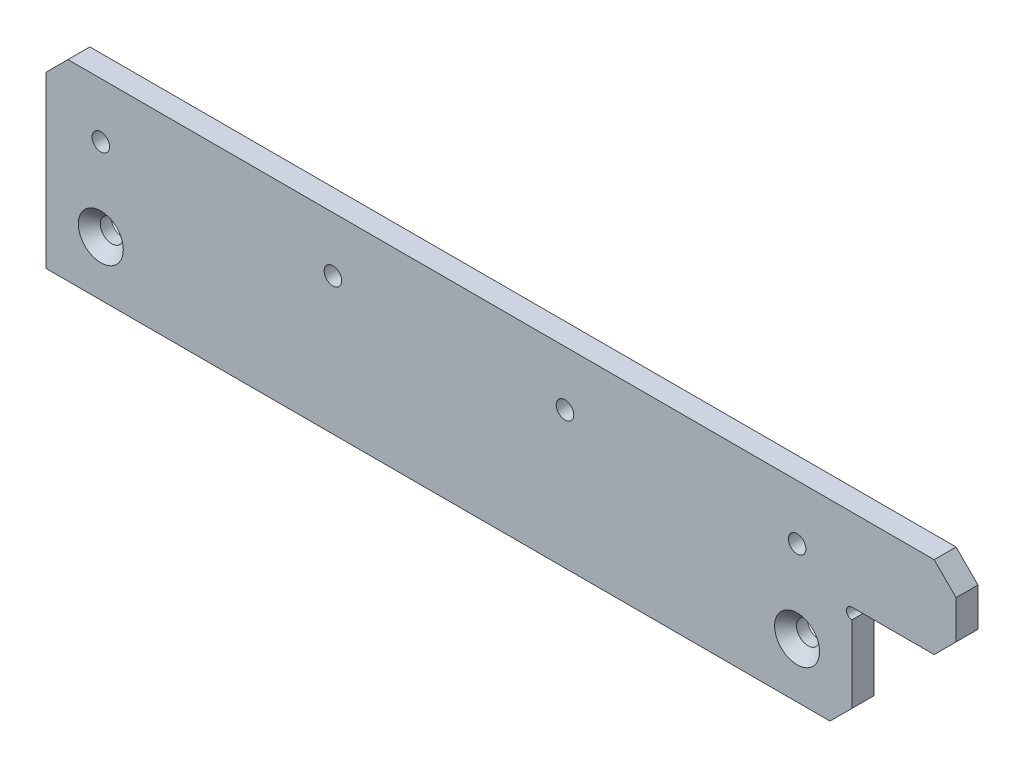
ISO-10303-21;
HEADER;
FILE_DESCRIPTION(('STEP AP214'),'2;1');
FILE_NAME('part.step','',(''),(''),'','','');
FILE_SCHEMA(('AUTOMOTIVE_DESIGN { 1 0 10303 214 1 1 1 1 }'));
ENDSEC;
DATA;
#1=APPLICATION_CONTEXT('core data for automotive mechanical design processes');
#2=APPLICATION_PROTOCOL_DEFINITION('international standard','automotive_design',2000,#1);
#3=PRODUCT_CONTEXT('',#1,'mechanical');
#4=PRODUCT('Part','Part','',(#3));
#5=PRODUCT_RELATED_PRODUCT_CATEGORY('part','',(#4));
#6=PRODUCT_DEFINITION_FORMATION('','',#4);
#7=PRODUCT_DEFINITION_CONTEXT('part definition',#1,'design');
#8=PRODUCT_DEFINITION('design','',#6,#7);
#9=PRODUCT_DEFINITION_SHAPE('','',#8);
#10=(LENGTH_UNIT() NAMED_UNIT(*) SI_UNIT(.MILLI.,.METRE.));
#11=(NAMED_UNIT(*) PLANE_ANGLE_UNIT() SI_UNIT($,.RADIAN.));
#12=(NAMED_UNIT(*) SI_UNIT($,.STERADIAN.) SOLID_ANGLE_UNIT());
#13=UNCERTAINTY_MEASURE_WITH_UNIT(LENGTH_MEASURE(1.E-05),#10,'distance_accuracy_value','');
#14=(GEOMETRIC_REPRESENTATION_CONTEXT(3) GLOBAL_UNCERTAINTY_ASSIGNED_CONTEXT((#13)) GLOBAL_UNIT_ASSIGNED_CONTEXT((#10,
#11,#12)) REPRESENTATION_CONTEXT('',''));
#15=CARTESIAN_POINT('',(0.,0.,0.));
#16=DIRECTION('',(0.,0.,1.));
#17=DIRECTION('',(1.,0.,0.));
#18=AXIS2_PLACEMENT_3D('',#15,#16,#17);
#19=CARTESIAN_POINT('',(-73.5,-17.5,2.));
#20=DIRECTION('',(1.,0.,0.));
#21=DIRECTION('',(0.,0.,-1.));
#22=AXIS2_PLACEMENT_3D('',#19,#20,#21);
#23=PLANE('',#22);
#24=DIRECTION('',(0.,-1.,0.));
#25=VECTOR('',#24,1.);
#26=CARTESIAN_POINT('',(-73.5,-17.5,2.));
#27=LINE('',#26,#25);
#28=CARTESIAN_POINT('',(-73.5,13.5,2.));
#29=VERTEX_POINT('',#28);
#30=CARTESIAN_POINT('',(-73.5,-17.5,2.));
#31=VERTEX_POINT('',#30);
#32=EDGE_CURVE('E160',#29,#31,#27,.T.);
#33=ORIENTED_EDGE('',*,*,#32,.F.);
#34=DIRECTION('',(0.,0.,-1.));
#35=VECTOR('',#34,1.);
#36=CARTESIAN_POINT('',(-73.5,13.5,2.));
#37=LINE('',#36,#35);
#38=CARTESIAN_POINT('',(-73.5,13.5,-2.));
#39=VERTEX_POINT('',#38);
#40=EDGE_CURVE('E210',#29,#39,#37,.T.);
#41=ORIENTED_EDGE('',*,*,#40,.T.);
#42=DIRECTION('',(0.,-1.,0.));
#43=VECTOR('',#42,1.);
#44=CARTESIAN_POINT('',(-73.5,-17.5,-2.));
#45=LINE('',#44,#43);
#46=CARTESIAN_POINT('',(-73.5,-17.5,-2.));
#47=VERTEX_POINT('',#46);
#48=EDGE_CURVE('E132',#39,#47,#45,.T.);
#49=ORIENTED_EDGE('',*,*,#48,.T.);
#50=DIRECTION('',(0.,0.,-1.));
#51=VECTOR('',#50,1.);
#52=CARTESIAN_POINT('',(-73.5,-17.5,2.));
#53=LINE('',#52,#51);
#54=EDGE_CURVE('E170',#31,#47,#53,.T.);
#55=ORIENTED_EDGE('',*,*,#54,.F.);
#56=EDGE_LOOP('',(#33,#41,#49,#55));
#57=FACE_BOUND('',#56,.T.);
#58=ADVANCED_FACE('F37',(#57),#23,.F.);
#59=CARTESIAN_POINT('',(73.5,-17.5,2.));
#60=DIRECTION('',(0.,1.,0.));
#61=DIRECTION('',(-1.,0.,0.));
#62=AXIS2_PLACEMENT_3D('',#59,#60,#61);
#63=PLANE('',#62);
#64=DIRECTION('',(1.,0.,0.));
#65=VECTOR('',#64,1.);
#66=CARTESIAN_POINT('',(73.5,-17.5,-2.));
#67=LINE('',#66,#65);
#68=CARTESIAN_POINT('',(69.5,-17.5,-2.));
#69=VERTEX_POINT('',#68);
#70=EDGE_CURVE('E172',#47,#69,#67,.T.);
#71=ORIENTED_EDGE('',*,*,#70,.T.);
#72=DIRECTION('',(0.,0.,1.));
#73=VECTOR('',#72,1.);
#74=CARTESIAN_POINT('',(69.5,-17.5,2.));
#75=LINE('',#74,#73);
#76=CARTESIAN_POINT('',(69.5,-17.5,2.));
#77=VERTEX_POINT('',#76);
#78=EDGE_CURVE('E208',#69,#77,#75,.T.);
#79=ORIENTED_EDGE('',*,*,#78,.T.);
#80=DIRECTION('',(1.,0.,0.));
#81=VECTOR('',#80,1.);
#82=CARTESIAN_POINT('',(73.5,-17.5,2.));
#83=LINE('',#82,#81);
#84=EDGE_CURVE('E162',#31,#77,#83,.T.);
#85=ORIENTED_EDGE('',*,*,#84,.F.);
#86=ORIENTED_EDGE('',*,*,#54,.T.);
#87=EDGE_LOOP('',(#71,#79,#85,#86));
#88=FACE_BOUND('',#87,.T.);
#89=ADVANCED_FACE('F267',(#88),#63,.F.);
#90=CARTESIAN_POINT('',(73.5,-17.5,2.));
#91=DIRECTION('',(-1.,0.,0.));
#92=DIRECTION('',(0.,0.,1.));
#93=AXIS2_PLACEMENT_3D('',#90,#91,#92);
#94=PLANE('',#93);
#95=DIRECTION('',(0.,1.,0.));
#96=VECTOR('',#95,1.);
#97=CARTESIAN_POINT('',(73.5,-17.5,-2.));
#98=LINE('',#97,#96);
#99=CARTESIAN_POINT('',(73.5,-13.5,-2.));
#100=VERTEX_POINT('',#99);
#101=CARTESIAN_POINT('',(73.5,0.500000000000011,-2.));
#102=VERTEX_POINT('',#101);
#103=EDGE_CURVE('E174',#100,#102,#98,.T.);
#104=ORIENTED_EDGE('',*,*,#103,.T.);
#105=DIRECTION('',(0.,0.,1.));
#106=VECTOR('',#105,1.);
#107=CARTESIAN_POINT('',(73.5,0.500000000000011,-2.));
#108=LINE('',#107,#106);
#109=CARTESIAN_POINT('',(73.5,0.500000000000011,2.));
#110=VERTEX_POINT('',#109);
#111=EDGE_CURVE('E237',#102,#110,#108,.T.);
#112=ORIENTED_EDGE('',*,*,#111,.T.);
#113=DIRECTION('',(0.,1.,0.));
#114=VECTOR('',#113,1.);
#115=CARTESIAN_POINT('',(73.5,-17.5,2.));
#116=LINE('',#115,#114);
#117=CARTESIAN_POINT('',(73.5,-13.5,2.));
#118=VERTEX_POINT('',#117);
#119=EDGE_CURVE('E141',#118,#110,#116,.T.);
#120=ORIENTED_EDGE('',*,*,#119,.F.);
#121=DIRECTION('',(0.,0.,-1.));
#122=VECTOR('',#121,1.);
#123=CARTESIAN_POINT('',(73.5,-13.5,2.));
#124=LINE('',#123,#122);
#125=EDGE_CURVE('E206',#118,#100,#124,.T.);
#126=ORIENTED_EDGE('',*,*,#125,.T.);
#127=EDGE_LOOP('',(#104,#112,#120,#126));
#128=FACE_BOUND('',#127,.T.);
#129=ADVANCED_FACE('F271',(#128),#94,.F.);
#130=CARTESIAN_POINT('',(73.5,17.5,2.));
#131=DIRECTION('',(0.,-1.,0.));
#132=DIRECTION('',(1.,0.,0.));
#133=AXIS2_PLACEMENT_3D('',#130,#131,#132);
#134=PLANE('',#133);
#135=DIRECTION('',(-1.,0.,0.));
#136=VECTOR('',#135,1.);
#137=CARTESIAN_POINT('',(73.5,17.5,2.));
#138=LINE('',#137,#136);
#139=CARTESIAN_POINT('',(88.5,17.5,2.));
#140=VERTEX_POINT('',#139);
#141=CARTESIAN_POINT('',(-69.5,17.5,2.));
#142=VERTEX_POINT('',#141);
#143=EDGE_CURVE('E167',#140,#142,#138,.T.);
#144=ORIENTED_EDGE('',*,*,#143,.F.);
#145=DIRECTION('',(0.,0.,-1.));
#146=VECTOR('',#145,1.);
#147=CARTESIAN_POINT('',(88.5,17.5,-2.));
#148=LINE('',#147,#146);
#149=CARTESIAN_POINT('',(88.5,17.5,-2.));
#150=VERTEX_POINT('',#149);
#151=EDGE_CURVE('E196',#140,#150,#148,.T.);
#152=ORIENTED_EDGE('',*,*,#151,.T.);
#153=DIRECTION('',(-1.,0.,0.));
#154=VECTOR('',#153,1.);
#155=CARTESIAN_POINT('',(73.5,17.5,-2.));
#156=LINE('',#155,#154);
#157=CARTESIAN_POINT('',(-69.5,17.5,-2.));
#158=VERTEX_POINT('',#157);
#159=EDGE_CURVE('E163',#150,#158,#156,.T.);
#160=ORIENTED_EDGE('',*,*,#159,.T.);
#161=DIRECTION('',(0.,0.,1.));
#162=VECTOR('',#161,1.);
#163=CARTESIAN_POINT('',(-69.5,17.5,2.));
#164=LINE('',#163,#162);
#165=EDGE_CURVE('E194',#158,#142,#164,.T.);
#166=ORIENTED_EDGE('',*,*,#165,.T.);
#167=EDGE_LOOP('',(#144,#152,#160,#166));
#168=FACE_BOUND('',#167,.T.);
#169=ADVANCED_FACE('F255',(#168),#134,.F.);
#170=CARTESIAN_POINT('',(0.,0.,2.));
#171=DIRECTION('',(0.,0.,1.));
#172=DIRECTION('',(1.,0.,0.));
#173=AXIS2_PLACEMENT_3D('',#170,#171,#172);
#174=PLANE('',#173);
#175=CARTESIAN_POINT('',(63.5,-7.50000000000001,2.));
#176=DIRECTION('',(0.,0.,1.));
#177=DIRECTION('',(1.,0.,0.));
#178=AXIS2_PLACEMENT_3D('',#175,#176,#177);
#179=CIRCLE('',#178,4.10000000000002);
#180=CARTESIAN_POINT('',(67.6,-7.50000000000001,2.));
#181=VERTEX_POINT('',#180);
#182=EDGE_CURVE('E46',#181,#181,#179,.F.);
#183=ORIENTED_EDGE('',*,*,#182,.T.);
#184=EDGE_LOOP('',(#183));
#185=FACE_BOUND('',#184,.T.);
#186=CARTESIAN_POINT('',(-63.5,-7.50000000000001,2.));
#187=DIRECTION('',(0.,0.,1.));
#188=DIRECTION('',(1.,0.,0.));
#189=AXIS2_PLACEMENT_3D('',#186,#187,#188);
#190=CIRCLE('',#189,4.10000000000002);
#191=CARTESIAN_POINT('',(-59.4,-7.50000000000001,2.));
#192=VERTEX_POINT('',#191);
#193=EDGE_CURVE('E216',#192,#192,#190,.F.);
#194=ORIENTED_EDGE('',*,*,#193,.T.);
#195=EDGE_LOOP('',(#194));
#196=FACE_BOUND('',#195,.T.);
#197=CARTESIAN_POINT('',(-63.5,7.49999999999999,2.));
#198=DIRECTION('',(0.,0.,1.));
#199=DIRECTION('',(1.,0.,0.));
#200=AXIS2_PLACEMENT_3D('',#197,#198,#199);
#201=CIRCLE('',#200,1.6);
#202=CARTESIAN_POINT('',(-61.9,7.49999999999999,2.));
#203=VERTEX_POINT('',#202);
#204=EDGE_CURVE('E293',#203,#203,#201,.T.);
#205=ORIENTED_EDGE('',*,*,#204,.F.);
#206=EDGE_LOOP('',(#205));
#207=FACE_BOUND('',#206,.T.);
#208=CARTESIAN_POINT('',(-21.1666666666667,7.49999999999999,2.));
#209=DIRECTION('',(0.,0.,1.));
#210=DIRECTION('',(1.,0.,0.));
#211=AXIS2_PLACEMENT_3D('',#208,#209,#210);
#212=CIRCLE('',#211,1.6);
#213=CARTESIAN_POINT('',(-19.5666666666667,7.49999999999999,2.));
#214=VERTEX_POINT('',#213);
#215=EDGE_CURVE('E287',#214,#214,#212,.T.);
#216=ORIENTED_EDGE('',*,*,#215,.F.);
#217=EDGE_LOOP('',(#216));
#218=FACE_BOUND('',#217,.T.);
#219=CARTESIAN_POINT('',(21.1666666666667,7.49999999999999,2.));
#220=DIRECTION('',(0.,0.,1.));
#221=DIRECTION('',(1.,0.,0.));
#222=AXIS2_PLACEMENT_3D('',#219,#220,#221);
#223=CIRCLE('',#222,1.6);
#224=CARTESIAN_POINT('',(22.7666666666667,7.49999999999999,2.));
#225=VERTEX_POINT('',#224);
#226=EDGE_CURVE('E281',#225,#225,#223,.T.);
#227=ORIENTED_EDGE('',*,*,#226,.F.);
#228=EDGE_LOOP('',(#227));
#229=FACE_BOUND('',#228,.T.);
#230=CARTESIAN_POINT('',(63.5,7.49999999999999,2.));
#231=DIRECTION('',(0.,0.,1.));
#232=DIRECTION('',(1.,0.,0.));
#233=AXIS2_PLACEMENT_3D('',#230,#231,#232);
#234=CIRCLE('',#233,1.6);
#235=CARTESIAN_POINT('',(65.1,7.49999999999999,2.));
#236=VERTEX_POINT('',#235);
#237=EDGE_CURVE('E275',#236,#236,#234,.T.);
#238=ORIENTED_EDGE('',*,*,#237,.F.);
#239=EDGE_LOOP('',(#238));
#240=FACE_BOUND('',#239,.T.);
#241=CARTESIAN_POINT('',(73.5,1.50000000000001,2.));
#242=DIRECTION('',(0.,0.,1.));
#243=DIRECTION('',(1.,0.,0.));
#244=AXIS2_PLACEMENT_3D('',#241,#242,#243);
#245=CIRCLE('',#244,0.999999999999998);
#246=CARTESIAN_POINT('',(73.5,2.50000000000001,2.));
#247=VERTEX_POINT('',#246);
#248=EDGE_CURVE('E124',#247,#110,#245,.T.);
#249=ORIENTED_EDGE('',*,*,#248,.F.);
#250=DIRECTION('',(1.,0.,0.));
#251=VECTOR('',#250,1.);
#252=CARTESIAN_POINT('',(73.5,2.50000000000001,2.));
#253=LINE('',#252,#251);
#254=CARTESIAN_POINT('',(88.5,2.50000000000001,2.));
#255=VERTEX_POINT('',#254);
#256=EDGE_CURVE('E139',#247,#255,#253,.T.);
#257=ORIENTED_EDGE('',*,*,#256,.T.);
#258=DIRECTION('',(-0.707106781186546,-0.707106781186549,0.));
#259=VECTOR('',#258,1.);
#260=CARTESIAN_POINT('',(43.0000000000001,-43.,2.));
#261=LINE('',#260,#259);
#262=CARTESIAN_POINT('',(92.5,6.50000000000004,2.));
#263=VERTEX_POINT('',#262);
#264=EDGE_CURVE('E190',#255,#263,#261,.F.);
#265=ORIENTED_EDGE('',*,*,#264,.T.);
#266=DIRECTION('',(0.,1.,0.));
#267=VECTOR('',#266,1.);
#268=CARTESIAN_POINT('',(92.5,17.5,2.));
#269=LINE('',#268,#267);
#270=CARTESIAN_POINT('',(92.5,13.5,2.));
#271=VERTEX_POINT('',#270);
#272=EDGE_CURVE('E148',#263,#271,#269,.T.);
#273=ORIENTED_EDGE('',*,*,#272,.T.);
#274=DIRECTION('',(-0.707106781186549,0.707106781186546,0.));
#275=VECTOR('',#274,1.);
#276=CARTESIAN_POINT('',(52.9999999999999,53.,2.));
#277=LINE('',#276,#275);
#278=EDGE_CURVE('E192',#271,#140,#277,.T.);
#279=ORIENTED_EDGE('',*,*,#278,.T.);
#280=ORIENTED_EDGE('',*,*,#143,.T.);
#281=DIRECTION('',(0.70710678118655,0.707106781186545,0.));
#282=VECTOR('',#281,1.);
#283=CARTESIAN_POINT('',(-43.4999999999997,43.5,2.));
#284=LINE('',#283,#282);
#285=EDGE_CURVE('E186',#142,#29,#284,.F.);
#286=ORIENTED_EDGE('',*,*,#285,.T.);
#287=ORIENTED_EDGE('',*,*,#32,.T.);
#288=ORIENTED_EDGE('',*,*,#84,.T.);
#289=DIRECTION('',(-0.707106781186549,-0.707106781186546,0.));
#290=VECTOR('',#289,1.);
#291=CARTESIAN_POINT('',(43.4999999999999,-43.5,2.));
#292=LINE('',#291,#290);
#293=EDGE_CURVE('E188',#77,#118,#292,.F.);
#294=ORIENTED_EDGE('',*,*,#293,.T.);
#295=ORIENTED_EDGE('',*,*,#119,.T.);
#296=EDGE_LOOP('',(#249,#257,#265,#273,#279,#280,#286,#287,#288,#294,#295));
#297=FACE_BOUND('',#296,.T.);
#298=ADVANCED_FACE('F138',(#185,#196,#207,#218,#229,#240,#297),#174,.T.);
#299=CARTESIAN_POINT('',(0.,0.,-2.));
#300=DIRECTION('',(0.,0.,1.));
#301=DIRECTION('',(1.,0.,0.));
#302=AXIS2_PLACEMENT_3D('',#299,#300,#301);
#303=PLANE('',#302);
#304=CARTESIAN_POINT('',(-63.5,7.49999999999999,-2.));
#305=DIRECTION('',(0.,0.,1.));
#306=DIRECTION('',(1.,0.,0.));
#307=AXIS2_PLACEMENT_3D('',#304,#305,#306);
#308=CIRCLE('',#307,1.6);
#309=CARTESIAN_POINT('',(-61.9,7.49999999999999,-2.));
#310=VERTEX_POINT('',#309);
#311=EDGE_CURVE('E142',#310,#310,#308,.T.);
#312=ORIENTED_EDGE('',*,*,#311,.T.);
#313=EDGE_LOOP('',(#312));
#314=FACE_BOUND('',#313,.T.);
#315=CARTESIAN_POINT('',(-21.1666666666667,7.49999999999999,-2.));
#316=DIRECTION('',(0.,0.,1.));
#317=DIRECTION('',(1.,0.,0.));
#318=AXIS2_PLACEMENT_3D('',#315,#316,#317);
#319=CIRCLE('',#318,1.6);
#320=CARTESIAN_POINT('',(-19.5666666666667,7.49999999999999,-2.));
#321=VERTEX_POINT('',#320);
#322=EDGE_CURVE('E290',#321,#321,#319,.T.);
#323=ORIENTED_EDGE('',*,*,#322,.T.);
#324=EDGE_LOOP('',(#323));
#325=FACE_BOUND('',#324,.T.);
#326=CARTESIAN_POINT('',(21.1666666666667,7.49999999999999,-2.));
#327=DIRECTION('',(0.,0.,1.));
#328=DIRECTION('',(1.,0.,0.));
#329=AXIS2_PLACEMENT_3D('',#326,#327,#328);
#330=CIRCLE('',#329,1.6);
#331=CARTESIAN_POINT('',(22.7666666666667,7.49999999999999,-2.));
#332=VERTEX_POINT('',#331);
#333=EDGE_CURVE('E284',#332,#332,#330,.T.);
#334=ORIENTED_EDGE('',*,*,#333,.T.);
#335=EDGE_LOOP('',(#334));
#336=FACE_BOUND('',#335,.T.);
#337=CARTESIAN_POINT('',(63.5,7.49999999999999,-2.));
#338=DIRECTION('',(0.,0.,1.));
#339=DIRECTION('',(1.,0.,0.));
#340=AXIS2_PLACEMENT_3D('',#337,#338,#339);
#341=CIRCLE('',#340,1.6);
#342=CARTESIAN_POINT('',(65.1,7.49999999999999,-2.));
#343=VERTEX_POINT('',#342);
#344=EDGE_CURVE('E278',#343,#343,#341,.T.);
#345=ORIENTED_EDGE('',*,*,#344,.T.);
#346=EDGE_LOOP('',(#345));
#347=FACE_BOUND('',#346,.T.);
#348=CARTESIAN_POINT('',(-63.5,-7.50000000000001,-2.));
#349=DIRECTION('',(0.,0.,1.));
#350=DIRECTION('',(1.,0.,0.));
#351=AXIS2_PLACEMENT_3D('',#348,#349,#350);
#352=CIRCLE('',#351,2.1);
#353=CARTESIAN_POINT('',(-61.4,-7.50000000000001,-2.));
#354=VERTEX_POINT('',#353);
#355=EDGE_CURVE('E149',#354,#354,#352,.T.);
#356=ORIENTED_EDGE('',*,*,#355,.T.);
#357=EDGE_LOOP('',(#356));
#358=FACE_BOUND('',#357,.T.);
#359=CARTESIAN_POINT('',(63.5,-7.50000000000001,-2.));
#360=DIRECTION('',(0.,0.,1.));
#361=DIRECTION('',(1.,0.,0.));
#362=AXIS2_PLACEMENT_3D('',#359,#360,#361);
#363=CIRCLE('',#362,2.09999999999999);
#364=CARTESIAN_POINT('',(65.6,-7.50000000000001,-2.));
#365=VERTEX_POINT('',#364);
#366=EDGE_CURVE('E155',#365,#365,#363,.T.);
#367=ORIENTED_EDGE('',*,*,#366,.T.);
#368=EDGE_LOOP('',(#367));
#369=FACE_BOUND('',#368,.T.);
#370=DIRECTION('',(1.,0.,0.));
#371=VECTOR('',#370,1.);
#372=CARTESIAN_POINT('',(73.5,2.50000000000001,-2.));
#373=LINE('',#372,#371);
#374=CARTESIAN_POINT('',(73.5,2.50000000000001,-2.));
#375=VERTEX_POINT('',#374);
#376=CARTESIAN_POINT('',(88.5,2.50000000000001,-2.));
#377=VERTEX_POINT('',#376);
#378=EDGE_CURVE('E152',#375,#377,#373,.T.);
#379=ORIENTED_EDGE('',*,*,#378,.F.);
#380=CARTESIAN_POINT('',(73.5,1.50000000000001,-2.));
#381=DIRECTION('',(0.,0.,1.));
#382=DIRECTION('',(1.,0.,0.));
#383=AXIS2_PLACEMENT_3D('',#380,#381,#382);
#384=CIRCLE('',#383,0.999999999999998);
#385=EDGE_CURVE('E127',#375,#102,#384,.T.);
#386=ORIENTED_EDGE('',*,*,#385,.T.);
#387=ORIENTED_EDGE('',*,*,#103,.F.);
#388=DIRECTION('',(0.707106781186549,0.707106781186546,0.));
#389=VECTOR('',#388,1.);
#390=CARTESIAN_POINT('',(73.5,-13.5,-2.));
#391=LINE('',#390,#389);
#392=EDGE_CURVE('E53',#100,#69,#391,.F.);
#393=ORIENTED_EDGE('',*,*,#392,.T.);
#394=ORIENTED_EDGE('',*,*,#70,.F.);
#395=ORIENTED_EDGE('',*,*,#48,.F.);
#396=DIRECTION('',(-0.70710678118655,-0.707106781186545,0.));
#397=VECTOR('',#396,1.);
#398=CARTESIAN_POINT('',(-73.5,13.5,-2.));
#399=LINE('',#398,#397);
#400=EDGE_CURVE('E198',#39,#158,#399,.F.);
#401=ORIENTED_EDGE('',*,*,#400,.T.);
#402=ORIENTED_EDGE('',*,*,#159,.F.);
#403=DIRECTION('',(0.707106781186549,-0.707106781186546,0.));
#404=VECTOR('',#403,1.);
#405=CARTESIAN_POINT('',(92.5,13.5,-2.));
#406=LINE('',#405,#404);
#407=CARTESIAN_POINT('',(92.5,13.5,-2.));
#408=VERTEX_POINT('',#407);
#409=EDGE_CURVE('E203',#150,#408,#406,.T.);
#410=ORIENTED_EDGE('',*,*,#409,.T.);
#411=DIRECTION('',(0.,1.,0.));
#412=VECTOR('',#411,1.);
#413=CARTESIAN_POINT('',(92.5,17.5,-2.));
#414=LINE('',#413,#412);
#415=CARTESIAN_POINT('',(92.5,6.50000000000004,-2.));
#416=VERTEX_POINT('',#415);
#417=EDGE_CURVE('E133',#416,#408,#414,.T.);
#418=ORIENTED_EDGE('',*,*,#417,.F.);
#419=DIRECTION('',(0.707106781186546,0.707106781186549,0.));
#420=VECTOR('',#419,1.);
#421=CARTESIAN_POINT('',(88.5,2.50000000000001,-2.));
#422=LINE('',#421,#420);
#423=EDGE_CURVE('E201',#416,#377,#422,.F.);
#424=ORIENTED_EDGE('',*,*,#423,.T.);
#425=EDGE_LOOP('',(#379,#386,#387,#393,#394,#395,#401,#402,#410,#418,#424));
#426=FACE_BOUND('',#425,.T.);
#427=ADVANCED_FACE('F272',(#314,#325,#336,#347,#358,#369,#426),#303,.F.);
#428=CARTESIAN_POINT('',(92.5,17.5,-2.));
#429=DIRECTION('',(1.,0.,0.));
#430=DIRECTION('',(0.,0.,-1.));
#431=AXIS2_PLACEMENT_3D('',#428,#429,#430);
#432=PLANE('',#431);
#433=ORIENTED_EDGE('',*,*,#417,.T.);
#434=DIRECTION('',(0.,0.,1.));
#435=VECTOR('',#434,1.);
#436=CARTESIAN_POINT('',(92.5,13.5,2.));
#437=LINE('',#436,#435);
#438=EDGE_CURVE('E183',#408,#271,#437,.T.);
#439=ORIENTED_EDGE('',*,*,#438,.T.);
#440=ORIENTED_EDGE('',*,*,#272,.F.);
#441=DIRECTION('',(0.,0.,-1.));
#442=VECTOR('',#441,1.);
#443=CARTESIAN_POINT('',(92.5,6.50000000000004,-2.));
#444=LINE('',#443,#442);
#445=EDGE_CURVE('E181',#263,#416,#444,.T.);
#446=ORIENTED_EDGE('',*,*,#445,.T.);
#447=EDGE_LOOP('',(#433,#439,#440,#446));
#448=FACE_BOUND('',#447,.T.);
#449=ADVANCED_FACE('F244',(#448),#432,.T.);
#450=CARTESIAN_POINT('',(73.5,2.50000000000001,-2.));
#451=DIRECTION('',(0.,-1.,0.));
#452=DIRECTION('',(0.,0.,-1.));
#453=AXIS2_PLACEMENT_3D('',#450,#451,#452);
#454=PLANE('',#453);
#455=ORIENTED_EDGE('',*,*,#378,.T.);
#456=DIRECTION('',(0.,0.,1.));
#457=VECTOR('',#456,1.);
#458=CARTESIAN_POINT('',(88.5,2.50000000000001,-2.));
#459=LINE('',#458,#457);
#460=EDGE_CURVE('E147',#377,#255,#459,.T.);
#461=ORIENTED_EDGE('',*,*,#460,.T.);
#462=ORIENTED_EDGE('',*,*,#256,.F.);
#463=DIRECTION('',(0.,0.,1.));
#464=VECTOR('',#463,1.);
#465=CARTESIAN_POINT('',(73.5,2.50000000000001,-2.));
#466=LINE('',#465,#464);
#467=EDGE_CURVE('E121',#375,#247,#466,.T.);
#468=ORIENTED_EDGE('',*,*,#467,.F.);
#469=EDGE_LOOP('',(#455,#461,#462,#468));
#470=FACE_BOUND('',#469,.T.);
#471=ADVANCED_FACE('F145',(#470),#454,.T.);
#472=CARTESIAN_POINT('',(63.5,-7.50000000000001,-2.));
#473=DIRECTION('',(0.,0.,1.));
#474=DIRECTION('',(1.,0.,0.));
#475=AXIS2_PLACEMENT_3D('',#472,#473,#474);
#476=CYLINDRICAL_SURFACE('',#475,2.09999999999999);
#477=CARTESIAN_POINT('',(63.5,-7.50000000000001,0.));
#478=DIRECTION('',(0.,0.,1.));
#479=DIRECTION('',(1.,0.,0.));
#480=AXIS2_PLACEMENT_3D('',#477,#478,#479);
#481=CIRCLE('',#480,2.09999999999999);
#482=CARTESIAN_POINT('',(65.6,-7.50000000000001,0.));
#483=VERTEX_POINT('',#482);
#484=EDGE_CURVE('E213',#483,#483,#481,.T.);
#485=ORIENTED_EDGE('',*,*,#484,.T.);
#486=EDGE_LOOP('',(#485));
#487=FACE_BOUND('',#486,.T.);
#488=ORIENTED_EDGE('',*,*,#366,.F.);
#489=EDGE_LOOP('',(#488));
#490=FACE_BOUND('',#489,.T.);
#491=ADVANCED_FACE('F229',(#487,#490),#476,.F.);
#492=CARTESIAN_POINT('',(-63.5,-7.50000000000001,-2.));
#493=DIRECTION('',(0.,0.,1.));
#494=DIRECTION('',(1.,0.,0.));
#495=AXIS2_PLACEMENT_3D('',#492,#493,#494);
#496=CYLINDRICAL_SURFACE('',#495,2.1);
#497=CARTESIAN_POINT('',(-63.5,-7.50000000000001,0.));
#498=DIRECTION('',(0.,0.,1.));
#499=DIRECTION('',(1.,0.,0.));
#500=AXIS2_PLACEMENT_3D('',#497,#498,#499);
#501=CIRCLE('',#500,2.1);
#502=CARTESIAN_POINT('',(-61.4,-7.50000000000001,0.));
#503=VERTEX_POINT('',#502);
#504=EDGE_CURVE('E11',#503,#503,#501,.T.);
#505=ORIENTED_EDGE('',*,*,#504,.T.);
#506=EDGE_LOOP('',(#505));
#507=FACE_BOUND('',#506,.T.);
#508=ORIENTED_EDGE('',*,*,#355,.F.);
#509=EDGE_LOOP('',(#508));
#510=FACE_BOUND('',#509,.T.);
#511=ADVANCED_FACE('F232',(#507,#510),#496,.F.);
#512=CARTESIAN_POINT('',(92.5,13.5,-2.));
#513=DIRECTION('',(0.707106781186546,0.707106781186549,0.));
#514=DIRECTION('',(0.,0.,-1.));
#515=AXIS2_PLACEMENT_3D('',#512,#513,#514);
#516=PLANE('',#515);
#517=ORIENTED_EDGE('',*,*,#409,.F.);
#518=ORIENTED_EDGE('',*,*,#151,.F.);
#519=ORIENTED_EDGE('',*,*,#278,.F.);
#520=ORIENTED_EDGE('',*,*,#438,.F.);
#521=EDGE_LOOP('',(#517,#518,#519,#520));
#522=FACE_BOUND('',#521,.T.);
#523=ADVANCED_FACE('F250',(#522),#516,.T.);
#524=CARTESIAN_POINT('',(88.5,2.50000000000001,-2.));
#525=DIRECTION('',(-0.707106781186549,0.707106781186546,0.));
#526=DIRECTION('',(0.,0.,1.));
#527=AXIS2_PLACEMENT_3D('',#524,#525,#526);
#528=PLANE('',#527);
#529=ORIENTED_EDGE('',*,*,#423,.F.);
#530=ORIENTED_EDGE('',*,*,#445,.F.);
#531=ORIENTED_EDGE('',*,*,#264,.F.);
#532=ORIENTED_EDGE('',*,*,#460,.F.);
#533=EDGE_LOOP('',(#529,#530,#531,#532));
#534=FACE_BOUND('',#533,.T.);
#535=ADVANCED_FACE('F343',(#534),#528,.F.);
#536=CARTESIAN_POINT('',(73.5,-13.5,2.));
#537=DIRECTION('',(-0.707106781186546,0.707106781186549,0.));
#538=DIRECTION('',(0.,0.,-1.));
#539=AXIS2_PLACEMENT_3D('',#536,#537,#538);
#540=PLANE('',#539);
#541=ORIENTED_EDGE('',*,*,#293,.F.);
#542=ORIENTED_EDGE('',*,*,#78,.F.);
#543=ORIENTED_EDGE('',*,*,#392,.F.);
#544=ORIENTED_EDGE('',*,*,#125,.F.);
#545=EDGE_LOOP('',(#541,#542,#543,#544));
#546=FACE_BOUND('',#545,.T.);
#547=ADVANCED_FACE('F269',(#546),#540,.F.);
#548=CARTESIAN_POINT('',(-73.5,13.5,2.));
#549=DIRECTION('',(0.707106781186545,-0.70710678118655,0.));
#550=DIRECTION('',(0.,0.,-1.));
#551=AXIS2_PLACEMENT_3D('',#548,#549,#550);
#552=PLANE('',#551);
#553=ORIENTED_EDGE('',*,*,#285,.F.);
#554=ORIENTED_EDGE('',*,*,#165,.F.);
#555=ORIENTED_EDGE('',*,*,#400,.F.);
#556=ORIENTED_EDGE('',*,*,#40,.F.);
#557=EDGE_LOOP('',(#553,#554,#555,#556));
#558=FACE_BOUND('',#557,.T.);
#559=ADVANCED_FACE('F259',(#558),#552,.F.);
#560=CARTESIAN_POINT('',(73.5,1.50000000000001,-2.));
#561=DIRECTION('',(0.,0.,1.));
#562=DIRECTION('',(1.,0.,0.));
#563=AXIS2_PLACEMENT_3D('',#560,#561,#562);
#564=CYLINDRICAL_SURFACE('',#563,0.999999999999998);
#565=ORIENTED_EDGE('',*,*,#385,.F.);
#566=ORIENTED_EDGE('',*,*,#467,.T.);
#567=ORIENTED_EDGE('',*,*,#248,.T.);
#568=ORIENTED_EDGE('',*,*,#111,.F.);
#569=EDGE_LOOP('',(#565,#566,#567,#568));
#570=FACE_BOUND('',#569,.T.);
#571=ADVANCED_FACE('F123',(#570),#564,.F.);
#572=CARTESIAN_POINT('',(63.5,7.49999999999999,-2.));
#573=DIRECTION('',(0.,0.,1.));
#574=DIRECTION('',(1.,0.,0.));
#575=AXIS2_PLACEMENT_3D('',#572,#573,#574);
#576=CYLINDRICAL_SURFACE('',#575,1.6);
#577=ORIENTED_EDGE('',*,*,#344,.F.);
#578=EDGE_LOOP('',(#577));
#579=FACE_BOUND('',#578,.T.);
#580=ORIENTED_EDGE('',*,*,#237,.T.);
#581=EDGE_LOOP('',(#580));
#582=FACE_BOUND('',#581,.T.);
#583=ADVANCED_FACE('F316',(#579,#582),#576,.F.);
#584=CARTESIAN_POINT('',(21.1666666666667,7.49999999999999,-2.));
#585=DIRECTION('',(0.,0.,1.));
#586=DIRECTION('',(1.,0.,0.));
#587=AXIS2_PLACEMENT_3D('',#584,#585,#586);
#588=CYLINDRICAL_SURFACE('',#587,1.6);
#589=ORIENTED_EDGE('',*,*,#333,.F.);
#590=EDGE_LOOP('',(#589));
#591=FACE_BOUND('',#590,.T.);
#592=ORIENTED_EDGE('',*,*,#226,.T.);
#593=EDGE_LOOP('',(#592));
#594=FACE_BOUND('',#593,.T.);
#595=ADVANCED_FACE('F318',(#591,#594),#588,.F.);
#596=CARTESIAN_POINT('',(-21.1666666666667,7.49999999999999,-2.));
#597=DIRECTION('',(0.,0.,1.));
#598=DIRECTION('',(1.,0.,0.));
#599=AXIS2_PLACEMENT_3D('',#596,#597,#598);
#600=CYLINDRICAL_SURFACE('',#599,1.6);
#601=ORIENTED_EDGE('',*,*,#322,.F.);
#602=EDGE_LOOP('',(#601));
#603=FACE_BOUND('',#602,.T.);
#604=ORIENTED_EDGE('',*,*,#215,.T.);
#605=EDGE_LOOP('',(#604));
#606=FACE_BOUND('',#605,.T.);
#607=ADVANCED_FACE('F303',(#603,#606),#600,.F.);
#608=CARTESIAN_POINT('',(-63.5,7.49999999999999,-2.));
#609=DIRECTION('',(0.,0.,1.));
#610=DIRECTION('',(1.,0.,0.));
#611=AXIS2_PLACEMENT_3D('',#608,#609,#610);
#612=CYLINDRICAL_SURFACE('',#611,1.6);
#613=ORIENTED_EDGE('',*,*,#311,.F.);
#614=EDGE_LOOP('',(#613));
#615=FACE_BOUND('',#614,.T.);
#616=ORIENTED_EDGE('',*,*,#204,.T.);
#617=EDGE_LOOP('',(#616));
#618=FACE_BOUND('',#617,.T.);
#619=ADVANCED_FACE('F226',(#615,#618),#612,.F.);
#620=CARTESIAN_POINT('',(63.5,-7.50000000000001,0.));
#621=DIRECTION('',(0.,0.,1.));
#622=DIRECTION('',(1.,0.,0.));
#623=AXIS2_PLACEMENT_3D('',#620,#621,#622);
#624=CONICAL_SURFACE('',#623,2.09999999999999,0.78539816339745);
#625=ORIENTED_EDGE('',*,*,#182,.F.);
#626=EDGE_LOOP('',(#625));
#627=FACE_BOUND('',#626,.T.);
#628=ORIENTED_EDGE('',*,*,#484,.F.);
#629=EDGE_LOOP('',(#628));
#630=FACE_BOUND('',#629,.T.);
#631=ADVANCED_FACE('F223',(#627,#630),#624,.F.);
#632=CARTESIAN_POINT('',(-63.5,-7.50000000000001,0.));
#633=DIRECTION('',(0.,0.,1.));
#634=DIRECTION('',(1.,0.,0.));
#635=AXIS2_PLACEMENT_3D('',#632,#633,#634);
#636=CONICAL_SURFACE('',#635,2.1,0.78539816339745);
#637=ORIENTED_EDGE('',*,*,#193,.F.);
#638=EDGE_LOOP('',(#637));
#639=FACE_BOUND('',#638,.T.);
#640=ORIENTED_EDGE('',*,*,#504,.F.);
#641=EDGE_LOOP('',(#640));
#642=FACE_BOUND('',#641,.T.);
#643=ADVANCED_FACE('F40',(#639,#642),#636,.F.);
#644=CLOSED_SHELL('',(#58,#89,#129,#169,#298,#427,#449,#471,#491,#511,#523,#535,#547,#559,#571,
#583,#595,#607,#619,#631,#643));
#645=MANIFOLD_SOLID_BREP('B2',#644);
#646=ADVANCED_BREP_SHAPE_REPRESENTATION('',(#18,#645),#14);
#647=SHAPE_DEFINITION_REPRESENTATION(#9,#646);
ENDSEC;
END-ISO-10303-21;
